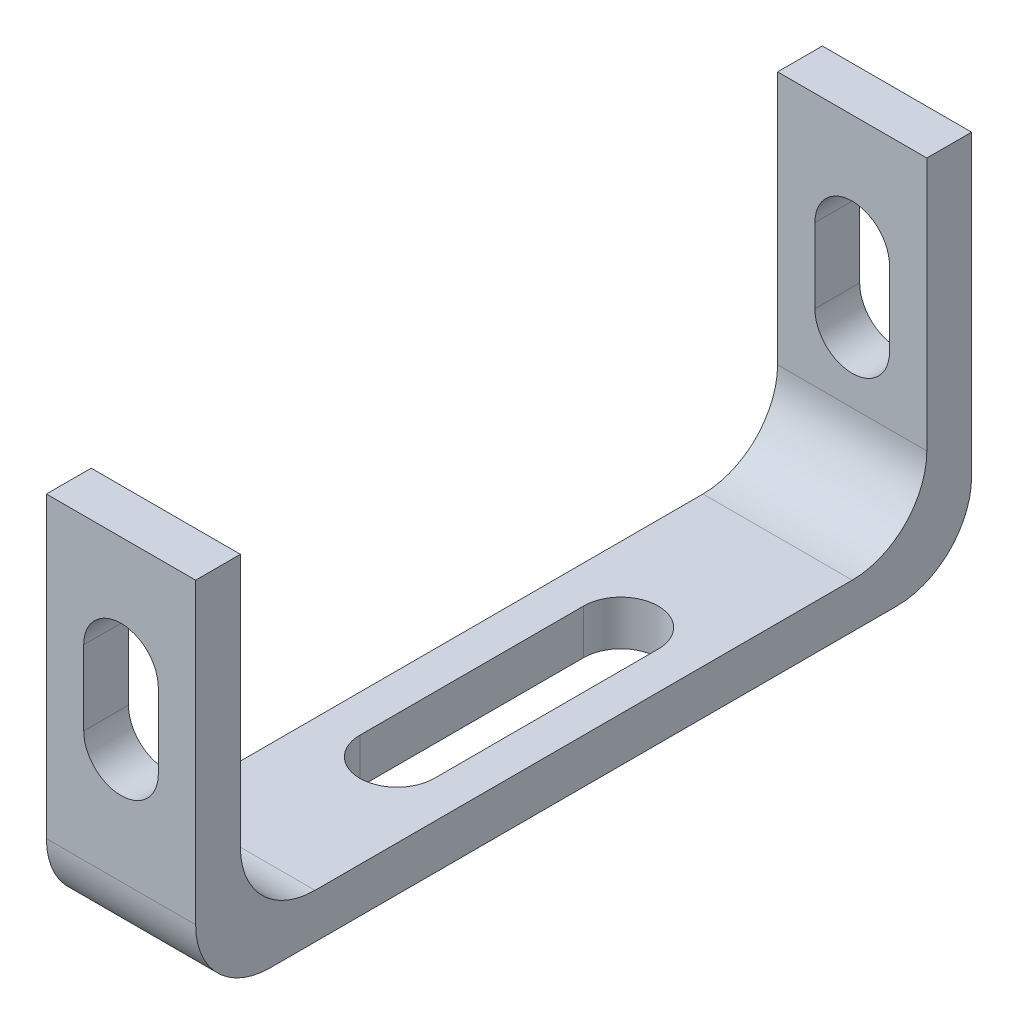
ISO-10303-21;
HEADER;
FILE_DESCRIPTION(('STEP AP214'),'2;1');
FILE_NAME('part.step','',(''),(''),'','','');
FILE_SCHEMA(('AUTOMOTIVE_DESIGN { 1 0 10303 214 1 1 1 1 }'));
ENDSEC;
DATA;
#1=APPLICATION_CONTEXT('core data for automotive mechanical design processes');
#2=APPLICATION_PROTOCOL_DEFINITION('international standard','automotive_design',2000,#1);
#3=PRODUCT_CONTEXT('',#1,'mechanical');
#4=PRODUCT('Part','Part','',(#3));
#5=PRODUCT_RELATED_PRODUCT_CATEGORY('part','',(#4));
#6=PRODUCT_DEFINITION_FORMATION('','',#4);
#7=PRODUCT_DEFINITION_CONTEXT('part definition',#1,'design');
#8=PRODUCT_DEFINITION('design','',#6,#7);
#9=PRODUCT_DEFINITION_SHAPE('','',#8);
#10=(LENGTH_UNIT() NAMED_UNIT(*) SI_UNIT(.MILLI.,.METRE.));
#11=(NAMED_UNIT(*) PLANE_ANGLE_UNIT() SI_UNIT($,.RADIAN.));
#12=(NAMED_UNIT(*) SI_UNIT($,.STERADIAN.) SOLID_ANGLE_UNIT());
#13=UNCERTAINTY_MEASURE_WITH_UNIT(LENGTH_MEASURE(1.E-05),#10,'distance_accuracy_value','');
#14=(GEOMETRIC_REPRESENTATION_CONTEXT(3) GLOBAL_UNCERTAINTY_ASSIGNED_CONTEXT((#13)) GLOBAL_UNIT_ASSIGNED_CONTEXT((#10,
#11,#12)) REPRESENTATION_CONTEXT('',''));
#15=CARTESIAN_POINT('',(0.,0.,0.));
#16=DIRECTION('',(0.,0.,1.));
#17=DIRECTION('',(1.,0.,0.));
#18=AXIS2_PLACEMENT_3D('',#15,#16,#17);
#19=CARTESIAN_POINT('',(10.,25.,0.));
#20=DIRECTION('',(0.,0.,-1.));
#21=DIRECTION('',(0.,1.,0.));
#22=AXIS2_PLACEMENT_3D('',#19,#20,#21);
#23=PLANE('',#22);
#24=DIRECTION('',(0.,-1.,0.));
#25=VECTOR('',#24,1.);
#26=CARTESIAN_POINT('',(2.5,17.5,0.));
#27=LINE('',#26,#25);
#28=CARTESIAN_POINT('',(2.5,17.5,0.));
#29=VERTEX_POINT('',#28);
#30=CARTESIAN_POINT('',(2.5,12.5,0.));
#31=VERTEX_POINT('',#30);
#32=EDGE_CURVE('E243',#29,#31,#27,.T.);
#33=ORIENTED_EDGE('',*,*,#32,.F.);
#34=CARTESIAN_POINT('',(5.,17.5,0.));
#35=DIRECTION('',(0.,0.,1.));
#36=DIRECTION('',(1.,0.,0.));
#37=AXIS2_PLACEMENT_3D('',#34,#35,#36);
#38=CIRCLE('',#37,2.5);
#39=CARTESIAN_POINT('',(7.49999999999999,17.5,0.));
#40=VERTEX_POINT('',#39);
#41=EDGE_CURVE('E55',#40,#29,#38,.T.);
#42=ORIENTED_EDGE('',*,*,#41,.F.);
#43=DIRECTION('',(0.,1.,0.));
#44=VECTOR('',#43,1.);
#45=CARTESIAN_POINT('',(7.49999999999999,17.5,0.));
#46=LINE('',#45,#44);
#47=CARTESIAN_POINT('',(7.5,12.5,0.));
#48=VERTEX_POINT('',#47);
#49=EDGE_CURVE('E230',#48,#40,#46,.T.);
#50=ORIENTED_EDGE('',*,*,#49,.F.);
#51=CARTESIAN_POINT('',(5.,12.5,0.));
#52=DIRECTION('',(0.,0.,1.));
#53=DIRECTION('',(1.,0.,0.));
#54=AXIS2_PLACEMENT_3D('',#51,#52,#53);
#55=CIRCLE('',#54,2.5);
#56=EDGE_CURVE('E234',#31,#48,#55,.T.);
#57=ORIENTED_EDGE('',*,*,#56,.F.);
#58=EDGE_LOOP('',(#33,#42,#50,#57));
#59=FACE_BOUND('',#58,.T.);
#60=DIRECTION('',(0.,-1.,0.));
#61=VECTOR('',#60,1.);
#62=CARTESIAN_POINT('',(0.,25.,0.));
#63=LINE('',#62,#61);
#64=CARTESIAN_POINT('',(0.,25.,0.));
#65=VERTEX_POINT('',#64);
#66=CARTESIAN_POINT('',(0.,5.,0.));
#67=VERTEX_POINT('',#66);
#68=EDGE_CURVE('E309',#65,#67,#63,.T.);
#69=ORIENTED_EDGE('',*,*,#68,.T.);
#70=DIRECTION('',(-1.,0.,0.));
#71=VECTOR('',#70,1.);
#72=CARTESIAN_POINT('',(10.,5.,0.));
#73=LINE('',#72,#71);
#74=CARTESIAN_POINT('',(10.,5.,0.));
#75=VERTEX_POINT('',#74);
#76=EDGE_CURVE('E403',#67,#75,#73,.F.);
#77=ORIENTED_EDGE('',*,*,#76,.T.);
#78=DIRECTION('',(0.,-1.,0.));
#79=VECTOR('',#78,1.);
#80=CARTESIAN_POINT('',(10.,25.,0.));
#81=LINE('',#80,#79);
#82=CARTESIAN_POINT('',(10.,25.,0.));
#83=VERTEX_POINT('',#82);
#84=EDGE_CURVE('E319',#83,#75,#81,.T.);
#85=ORIENTED_EDGE('',*,*,#84,.F.);
#86=DIRECTION('',(-1.,0.,0.));
#87=VECTOR('',#86,1.);
#88=CARTESIAN_POINT('',(10.,25.,0.));
#89=LINE('',#88,#87);
#90=EDGE_CURVE('E348',#83,#65,#89,.T.);
#91=ORIENTED_EDGE('',*,*,#90,.T.);
#92=EDGE_LOOP('',(#69,#77,#85,#91));
#93=FACE_BOUND('',#92,.T.);
#94=ADVANCED_FACE('F39',(#59,#93),#23,.F.);
#95=CARTESIAN_POINT('',(10.,0.,0.));
#96=DIRECTION('',(0.,1.,0.));
#97=DIRECTION('',(0.,0.,1.));
#98=AXIS2_PLACEMENT_3D('',#95,#96,#97);
#99=PLANE('',#98);
#100=DIRECTION('',(0.,0.,-1.));
#101=VECTOR('',#100,1.);
#102=CARTESIAN_POINT('',(7.5,0.,-33.5));
#103=LINE('',#102,#101);
#104=CARTESIAN_POINT('',(7.5,0.,-18.5));
#105=VERTEX_POINT('',#104);
#106=CARTESIAN_POINT('',(7.5,0.,-33.5));
#107=VERTEX_POINT('',#106);
#108=EDGE_CURVE('E288',#105,#107,#103,.T.);
#109=ORIENTED_EDGE('',*,*,#108,.T.);
#110=CARTESIAN_POINT('',(5.,0.,-33.5));
#111=DIRECTION('',(0.,1.,0.));
#112=DIRECTION('',(0.,0.,1.));
#113=AXIS2_PLACEMENT_3D('',#110,#111,#112);
#114=CIRCLE('',#113,2.5);
#115=CARTESIAN_POINT('',(2.5,0.,-33.5));
#116=VERTEX_POINT('',#115);
#117=EDGE_CURVE('E275',#107,#116,#114,.T.);
#118=ORIENTED_EDGE('',*,*,#117,.T.);
#119=DIRECTION('',(0.,0.,1.));
#120=VECTOR('',#119,1.);
#121=CARTESIAN_POINT('',(2.5,0.,-33.5));
#122=LINE('',#121,#120);
#123=CARTESIAN_POINT('',(2.5,0.,-18.5));
#124=VERTEX_POINT('',#123);
#125=EDGE_CURVE('E279',#116,#124,#122,.T.);
#126=ORIENTED_EDGE('',*,*,#125,.T.);
#127=CARTESIAN_POINT('',(5.,0.,-18.5));
#128=DIRECTION('',(0.,1.,0.));
#129=DIRECTION('',(0.,0.,1.));
#130=AXIS2_PLACEMENT_3D('',#127,#128,#129);
#131=CIRCLE('',#130,2.5);
#132=EDGE_CURVE('E284',#124,#105,#131,.T.);
#133=ORIENTED_EDGE('',*,*,#132,.T.);
#134=EDGE_LOOP('',(#109,#118,#126,#133));
#135=FACE_BOUND('',#134,.T.);
#136=DIRECTION('',(0.,0.,-1.));
#137=VECTOR('',#136,1.);
#138=CARTESIAN_POINT('',(10.,0.,0.));
#139=LINE('',#138,#137);
#140=CARTESIAN_POINT('',(10.,0.,-5.));
#141=VERTEX_POINT('',#140);
#142=CARTESIAN_POINT('',(10.,0.,-47.));
#143=VERTEX_POINT('',#142);
#144=EDGE_CURVE('E323',#141,#143,#139,.T.);
#145=ORIENTED_EDGE('',*,*,#144,.F.);
#146=DIRECTION('',(-1.,0.,0.));
#147=VECTOR('',#146,1.);
#148=CARTESIAN_POINT('',(10.,0.,-5.));
#149=LINE('',#148,#147);
#150=CARTESIAN_POINT('',(0.,0.,-5.));
#151=VERTEX_POINT('',#150);
#152=EDGE_CURVE('E393',#141,#151,#149,.T.);
#153=ORIENTED_EDGE('',*,*,#152,.T.);
#154=DIRECTION('',(0.,0.,-1.));
#155=VECTOR('',#154,1.);
#156=CARTESIAN_POINT('',(0.,0.,0.));
#157=LINE('',#156,#155);
#158=CARTESIAN_POINT('',(0.,0.,-47.));
#159=VERTEX_POINT('',#158);
#160=EDGE_CURVE('E352',#151,#159,#157,.T.);
#161=ORIENTED_EDGE('',*,*,#160,.T.);
#162=DIRECTION('',(-1.,0.,0.));
#163=VECTOR('',#162,1.);
#164=CARTESIAN_POINT('',(10.,0.,-47.));
#165=LINE('',#164,#163);
#166=EDGE_CURVE('E390',#159,#143,#165,.F.);
#167=ORIENTED_EDGE('',*,*,#166,.T.);
#168=EDGE_LOOP('',(#145,#153,#161,#167));
#169=FACE_BOUND('',#168,.T.);
#170=ADVANCED_FACE('F473',(#135,#169),#99,.F.);
#171=CARTESIAN_POINT('',(10.,0.,-52.));
#172=DIRECTION('',(0.,0.,1.));
#173=DIRECTION('',(1.,0.,0.));
#174=AXIS2_PLACEMENT_3D('',#171,#172,#173);
#175=PLANE('',#174);
#176=DIRECTION('',(0.,1.,0.));
#177=VECTOR('',#176,1.);
#178=CARTESIAN_POINT('',(7.49999999999999,17.5,-52.));
#179=LINE('',#178,#177);
#180=CARTESIAN_POINT('',(7.5,12.5,-52.));
#181=VERTEX_POINT('',#180);
#182=CARTESIAN_POINT('',(7.49999999999999,17.5,-52.));
#183=VERTEX_POINT('',#182);
#184=EDGE_CURVE('E228',#181,#183,#179,.T.);
#185=ORIENTED_EDGE('',*,*,#184,.T.);
#186=CARTESIAN_POINT('',(5.,17.5,-52.));
#187=DIRECTION('',(0.,0.,1.));
#188=DIRECTION('',(1.,0.,0.));
#189=AXIS2_PLACEMENT_3D('',#186,#187,#188);
#190=CIRCLE('',#189,2.5);
#191=CARTESIAN_POINT('',(2.5,17.5,-52.));
#192=VERTEX_POINT('',#191);
#193=EDGE_CURVE('E208',#183,#192,#190,.T.);
#194=ORIENTED_EDGE('',*,*,#193,.T.);
#195=DIRECTION('',(0.,-1.,0.));
#196=VECTOR('',#195,1.);
#197=CARTESIAN_POINT('',(2.5,17.5,-52.));
#198=LINE('',#197,#196);
#199=CARTESIAN_POINT('',(2.5,12.5,-52.));
#200=VERTEX_POINT('',#199);
#201=EDGE_CURVE('E219',#192,#200,#198,.T.);
#202=ORIENTED_EDGE('',*,*,#201,.T.);
#203=CARTESIAN_POINT('',(5.,12.5,-52.));
#204=DIRECTION('',(0.,0.,1.));
#205=DIRECTION('',(1.,0.,0.));
#206=AXIS2_PLACEMENT_3D('',#203,#204,#205);
#207=CIRCLE('',#206,2.5);
#208=EDGE_CURVE('E63',#200,#181,#207,.T.);
#209=ORIENTED_EDGE('',*,*,#208,.T.);
#210=EDGE_LOOP('',(#185,#194,#202,#209));
#211=FACE_BOUND('',#210,.T.);
#212=DIRECTION('',(0.,1.,0.));
#213=VECTOR('',#212,1.);
#214=CARTESIAN_POINT('',(10.,0.,-52.));
#215=LINE('',#214,#213);
#216=CARTESIAN_POINT('',(10.,5.,-52.));
#217=VERTEX_POINT('',#216);
#218=CARTESIAN_POINT('',(10.,25.,-52.));
#219=VERTEX_POINT('',#218);
#220=EDGE_CURVE('E328',#217,#219,#215,.T.);
#221=ORIENTED_EDGE('',*,*,#220,.F.);
#222=DIRECTION('',(-1.,0.,0.));
#223=VECTOR('',#222,1.);
#224=CARTESIAN_POINT('',(10.,5.,-52.));
#225=LINE('',#224,#223);
#226=CARTESIAN_POINT('',(0.,5.,-52.));
#227=VERTEX_POINT('',#226);
#228=EDGE_CURVE('E412',#217,#227,#225,.T.);
#229=ORIENTED_EDGE('',*,*,#228,.T.);
#230=DIRECTION('',(0.,1.,0.));
#231=VECTOR('',#230,1.);
#232=CARTESIAN_POINT('',(0.,0.,-52.));
#233=LINE('',#232,#231);
#234=CARTESIAN_POINT('',(0.,25.,-52.));
#235=VERTEX_POINT('',#234);
#236=EDGE_CURVE('E356',#227,#235,#233,.T.);
#237=ORIENTED_EDGE('',*,*,#236,.T.);
#238=DIRECTION('',(-1.,0.,0.));
#239=VECTOR('',#238,1.);
#240=CARTESIAN_POINT('',(10.,25.,-52.));
#241=LINE('',#240,#239);
#242=EDGE_CURVE('E386',#219,#235,#241,.T.);
#243=ORIENTED_EDGE('',*,*,#242,.F.);
#244=EDGE_LOOP('',(#221,#229,#237,#243));
#245=FACE_BOUND('',#244,.T.);
#246=ADVANCED_FACE('F225',(#211,#245),#175,.F.);
#247=CARTESIAN_POINT('',(10.,25.,-49.));
#248=DIRECTION('',(0.,-1.,0.));
#249=DIRECTION('',(0.,0.,-1.));
#250=AXIS2_PLACEMENT_3D('',#247,#248,#249);
#251=PLANE('',#250);
#252=DIRECTION('',(0.,0.,1.));
#253=VECTOR('',#252,1.);
#254=CARTESIAN_POINT('',(0.,25.,-49.));
#255=LINE('',#254,#253);
#256=CARTESIAN_POINT('',(0.,25.,-49.));
#257=VERTEX_POINT('',#256);
#258=EDGE_CURVE('E359',#235,#257,#255,.T.);
#259=ORIENTED_EDGE('',*,*,#258,.T.);
#260=DIRECTION('',(-1.,0.,0.));
#261=VECTOR('',#260,1.);
#262=CARTESIAN_POINT('',(10.,25.,-49.));
#263=LINE('',#262,#261);
#264=CARTESIAN_POINT('',(10.,25.,-49.));
#265=VERTEX_POINT('',#264);
#266=EDGE_CURVE('E382',#265,#257,#263,.T.);
#267=ORIENTED_EDGE('',*,*,#266,.F.);
#268=DIRECTION('',(0.,0.,1.));
#269=VECTOR('',#268,1.);
#270=CARTESIAN_POINT('',(10.,25.,-49.));
#271=LINE('',#270,#269);
#272=EDGE_CURVE('E331',#219,#265,#271,.T.);
#273=ORIENTED_EDGE('',*,*,#272,.F.);
#274=ORIENTED_EDGE('',*,*,#242,.T.);
#275=EDGE_LOOP('',(#259,#267,#273,#274));
#276=FACE_BOUND('',#275,.T.);
#277=ADVANCED_FACE('F502',(#276),#251,.F.);
#278=CARTESIAN_POINT('',(10.,3.,-49.));
#279=DIRECTION('',(0.,0.,-1.));
#280=DIRECTION('',(-1.,0.,0.));
#281=AXIS2_PLACEMENT_3D('',#278,#279,#280);
#282=PLANE('',#281);
#283=DIRECTION('',(0.,1.,0.));
#284=VECTOR('',#283,1.);
#285=CARTESIAN_POINT('',(2.5,3.,-49.));
#286=LINE('',#285,#284);
#287=CARTESIAN_POINT('',(2.5,12.5,-49.));
#288=VERTEX_POINT('',#287);
#289=CARTESIAN_POINT('',(2.5,17.5,-49.));
#290=VERTEX_POINT('',#289);
#291=EDGE_CURVE('E253',#288,#290,#286,.T.);
#292=ORIENTED_EDGE('',*,*,#291,.T.);
#293=CARTESIAN_POINT('',(5.,17.5,-49.));
#294=DIRECTION('',(0.,0.,-1.));
#295=DIRECTION('',(-1.,0.,0.));
#296=AXIS2_PLACEMENT_3D('',#293,#294,#295);
#297=CIRCLE('',#296,2.5);
#298=CARTESIAN_POINT('',(7.49999999999999,17.5,-49.));
#299=VERTEX_POINT('',#298);
#300=EDGE_CURVE('E211',#290,#299,#297,.T.);
#301=ORIENTED_EDGE('',*,*,#300,.T.);
#302=DIRECTION('',(0.,-1.,0.));
#303=VECTOR('',#302,1.);
#304=CARTESIAN_POINT('',(7.5,3.,-49.));
#305=LINE('',#304,#303);
#306=CARTESIAN_POINT('',(7.5,12.5,-49.));
#307=VERTEX_POINT('',#306);
#308=EDGE_CURVE('E268',#299,#307,#305,.T.);
#309=ORIENTED_EDGE('',*,*,#308,.T.);
#310=CARTESIAN_POINT('',(5.,12.5,-49.));
#311=DIRECTION('',(0.,0.,-1.));
#312=DIRECTION('',(-1.,0.,0.));
#313=AXIS2_PLACEMENT_3D('',#310,#311,#312);
#314=CIRCLE('',#313,2.5);
#315=EDGE_CURVE('E264',#307,#288,#314,.T.);
#316=ORIENTED_EDGE('',*,*,#315,.T.);
#317=EDGE_LOOP('',(#292,#301,#309,#316));
#318=FACE_BOUND('',#317,.T.);
#319=DIRECTION('',(0.,-1.,0.));
#320=VECTOR('',#319,1.);
#321=CARTESIAN_POINT('',(0.,3.,-49.));
#322=LINE('',#321,#320);
#323=CARTESIAN_POINT('',(0.,8.,-49.));
#324=VERTEX_POINT('',#323);
#325=EDGE_CURVE('E362',#257,#324,#322,.T.);
#326=ORIENTED_EDGE('',*,*,#325,.T.);
#327=DIRECTION('',(-1.,0.,0.));
#328=VECTOR('',#327,1.);
#329=CARTESIAN_POINT('',(10.,8.,-49.));
#330=LINE('',#329,#328);
#331=CARTESIAN_POINT('',(10.,8.,-49.));
#332=VERTEX_POINT('',#331);
#333=EDGE_CURVE('E427',#324,#332,#330,.F.);
#334=ORIENTED_EDGE('',*,*,#333,.T.);
#335=DIRECTION('',(0.,-1.,0.));
#336=VECTOR('',#335,1.);
#337=CARTESIAN_POINT('',(10.,3.,-49.));
#338=LINE('',#337,#336);
#339=EDGE_CURVE('E334',#265,#332,#338,.T.);
#340=ORIENTED_EDGE('',*,*,#339,.F.);
#341=ORIENTED_EDGE('',*,*,#266,.T.);
#342=EDGE_LOOP('',(#326,#334,#340,#341));
#343=FACE_BOUND('',#342,.T.);
#344=ADVANCED_FACE('F538',(#318,#343),#282,.F.);
#345=CARTESIAN_POINT('',(10.,3.,-3.));
#346=DIRECTION('',(0.,-1.,0.));
#347=DIRECTION('',(0.,0.,-1.));
#348=AXIS2_PLACEMENT_3D('',#345,#346,#347);
#349=PLANE('',#348);
#350=DIRECTION('',(0.,0.,1.));
#351=VECTOR('',#350,1.);
#352=CARTESIAN_POINT('',(2.5,3.,-33.5));
#353=LINE('',#352,#351);
#354=CARTESIAN_POINT('',(2.5,3.,-33.5));
#355=VERTEX_POINT('',#354);
#356=CARTESIAN_POINT('',(2.5,3.,-18.5));
#357=VERTEX_POINT('',#356);
#358=EDGE_CURVE('E295',#355,#357,#353,.T.);
#359=ORIENTED_EDGE('',*,*,#358,.F.);
#360=CARTESIAN_POINT('',(5.,3.,-33.5));
#361=DIRECTION('',(0.,1.,0.));
#362=DIRECTION('',(0.,0.,1.));
#363=AXIS2_PLACEMENT_3D('',#360,#361,#362);
#364=CIRCLE('',#363,2.5);
#365=CARTESIAN_POINT('',(7.5,3.,-33.5));
#366=VERTEX_POINT('',#365);
#367=EDGE_CURVE('E274',#366,#355,#364,.T.);
#368=ORIENTED_EDGE('',*,*,#367,.F.);
#369=DIRECTION('',(0.,0.,-1.));
#370=VECTOR('',#369,1.);
#371=CARTESIAN_POINT('',(7.5,3.,-33.5));
#372=LINE('',#371,#370);
#373=CARTESIAN_POINT('',(7.5,3.,-18.5));
#374=VERTEX_POINT('',#373);
#375=EDGE_CURVE('E280',#374,#366,#372,.T.);
#376=ORIENTED_EDGE('',*,*,#375,.F.);
#377=CARTESIAN_POINT('',(5.,3.,-18.5));
#378=DIRECTION('',(0.,1.,0.));
#379=DIRECTION('',(0.,0.,1.));
#380=AXIS2_PLACEMENT_3D('',#377,#378,#379);
#381=CIRCLE('',#380,2.5);
#382=EDGE_CURVE('E299',#357,#374,#381,.T.);
#383=ORIENTED_EDGE('',*,*,#382,.F.);
#384=EDGE_LOOP('',(#359,#368,#376,#383));
#385=FACE_BOUND('',#384,.T.);
#386=DIRECTION('',(0.,0.,1.));
#387=VECTOR('',#386,1.);
#388=CARTESIAN_POINT('',(0.,3.,-3.));
#389=LINE('',#388,#387);
#390=CARTESIAN_POINT('',(0.,3.,-44.));
#391=VERTEX_POINT('',#390);
#392=CARTESIAN_POINT('',(0.,3.,-8.));
#393=VERTEX_POINT('',#392);
#394=EDGE_CURVE('E366',#391,#393,#389,.T.);
#395=ORIENTED_EDGE('',*,*,#394,.T.);
#396=DIRECTION('',(-1.,0.,0.));
#397=VECTOR('',#396,1.);
#398=CARTESIAN_POINT('',(10.,3.,-8.));
#399=LINE('',#398,#397);
#400=CARTESIAN_POINT('',(10.,3.,-8.));
#401=VERTEX_POINT('',#400);
#402=EDGE_CURVE('E424',#393,#401,#399,.F.);
#403=ORIENTED_EDGE('',*,*,#402,.T.);
#404=DIRECTION('',(0.,0.,1.));
#405=VECTOR('',#404,1.);
#406=CARTESIAN_POINT('',(10.,3.,-3.));
#407=LINE('',#406,#405);
#408=CARTESIAN_POINT('',(10.,3.,-44.));
#409=VERTEX_POINT('',#408);
#410=EDGE_CURVE('E338',#409,#401,#407,.T.);
#411=ORIENTED_EDGE('',*,*,#410,.F.);
#412=DIRECTION('',(-1.,0.,0.));
#413=VECTOR('',#412,1.);
#414=CARTESIAN_POINT('',(0.,3.,-44.));
#415=LINE('',#414,#413);
#416=EDGE_CURVE('E420',#409,#391,#415,.T.);
#417=ORIENTED_EDGE('',*,*,#416,.T.);
#418=EDGE_LOOP('',(#395,#403,#411,#417));
#419=FACE_BOUND('',#418,.T.);
#420=ADVANCED_FACE('F512',(#385,#419),#349,.F.);
#421=CARTESIAN_POINT('',(10.,25.,-3.));
#422=DIRECTION('',(0.,0.,1.));
#423=DIRECTION('',(0.,-1.,0.));
#424=AXIS2_PLACEMENT_3D('',#421,#422,#423);
#425=PLANE('',#424);
#426=DIRECTION('',(0.,1.,0.));
#427=VECTOR('',#426,1.);
#428=CARTESIAN_POINT('',(7.49999999999999,25.,-3.));
#429=LINE('',#428,#427);
#430=CARTESIAN_POINT('',(7.5,12.5,-3.00000000000002));
#431=VERTEX_POINT('',#430);
#432=CARTESIAN_POINT('',(7.49999999999999,17.5,-3.00000000000002));
#433=VERTEX_POINT('',#432);
#434=EDGE_CURVE('E48',#431,#433,#429,.T.);
#435=ORIENTED_EDGE('',*,*,#434,.T.);
#436=CARTESIAN_POINT('',(5.,17.5,-3.));
#437=DIRECTION('',(0.,0.,1.));
#438=DIRECTION('',(0.,-1.,0.));
#439=AXIS2_PLACEMENT_3D('',#436,#437,#438);
#440=CIRCLE('',#439,2.5);
#441=CARTESIAN_POINT('',(2.5,17.5,-3.00000000000002));
#442=VERTEX_POINT('',#441);
#443=EDGE_CURVE('E11',#433,#442,#440,.T.);
#444=ORIENTED_EDGE('',*,*,#443,.T.);
#445=DIRECTION('',(0.,-1.,0.));
#446=VECTOR('',#445,1.);
#447=CARTESIAN_POINT('',(2.5,25.,-3.));
#448=LINE('',#447,#446);
#449=CARTESIAN_POINT('',(2.5,12.5,-3.));
#450=VERTEX_POINT('',#449);
#451=EDGE_CURVE('E442',#442,#450,#448,.T.);
#452=ORIENTED_EDGE('',*,*,#451,.T.);
#453=CARTESIAN_POINT('',(5.,12.5,-3.));
#454=DIRECTION('',(0.,0.,1.));
#455=DIRECTION('',(0.,-1.,0.));
#456=AXIS2_PLACEMENT_3D('',#453,#454,#455);
#457=CIRCLE('',#456,2.5);
#458=EDGE_CURVE('E446',#450,#431,#457,.T.);
#459=ORIENTED_EDGE('',*,*,#458,.T.);
#460=EDGE_LOOP('',(#435,#444,#452,#459));
#461=FACE_BOUND('',#460,.T.);
#462=DIRECTION('',(0.,1.,0.));
#463=VECTOR('',#462,1.);
#464=CARTESIAN_POINT('',(10.,25.,-3.));
#465=LINE('',#464,#463);
#466=CARTESIAN_POINT('',(10.,8.,-3.));
#467=VERTEX_POINT('',#466);
#468=CARTESIAN_POINT('',(10.,25.,-3.));
#469=VERTEX_POINT('',#468);
#470=EDGE_CURVE('E342',#467,#469,#465,.T.);
#471=ORIENTED_EDGE('',*,*,#470,.F.);
#472=DIRECTION('',(-1.,0.,0.));
#473=VECTOR('',#472,1.);
#474=CARTESIAN_POINT('',(0.,8.,-3.));
#475=LINE('',#474,#473);
#476=CARTESIAN_POINT('',(0.,8.,-3.));
#477=VERTEX_POINT('',#476);
#478=EDGE_CURVE('E416',#467,#477,#475,.T.);
#479=ORIENTED_EDGE('',*,*,#478,.T.);
#480=DIRECTION('',(0.,1.,0.));
#481=VECTOR('',#480,1.);
#482=CARTESIAN_POINT('',(0.,25.,-3.));
#483=LINE('',#482,#481);
#484=CARTESIAN_POINT('',(0.,25.,-3.));
#485=VERTEX_POINT('',#484);
#486=EDGE_CURVE('E370',#477,#485,#483,.T.);
#487=ORIENTED_EDGE('',*,*,#486,.T.);
#488=DIRECTION('',(-1.,0.,0.));
#489=VECTOR('',#488,1.);
#490=CARTESIAN_POINT('',(10.,25.,-3.));
#491=LINE('',#490,#489);
#492=EDGE_CURVE('E378',#469,#485,#491,.T.);
#493=ORIENTED_EDGE('',*,*,#492,.F.);
#494=EDGE_LOOP('',(#471,#479,#487,#493));
#495=FACE_BOUND('',#494,.T.);
#496=ADVANCED_FACE('F452',(#461,#495),#425,.F.);
#497=CARTESIAN_POINT('',(10.,25.,0.));
#498=DIRECTION('',(0.,-1.,0.));
#499=DIRECTION('',(0.,0.,-1.));
#500=AXIS2_PLACEMENT_3D('',#497,#498,#499);
#501=PLANE('',#500);
#502=DIRECTION('',(0.,0.,1.));
#503=VECTOR('',#502,1.);
#504=CARTESIAN_POINT('',(0.,25.,0.));
#505=LINE('',#504,#503);
#506=EDGE_CURVE('E324',#485,#65,#505,.T.);
#507=ORIENTED_EDGE('',*,*,#506,.T.);
#508=ORIENTED_EDGE('',*,*,#90,.F.);
#509=DIRECTION('',(0.,0.,1.));
#510=VECTOR('',#509,1.);
#511=CARTESIAN_POINT('',(10.,25.,0.));
#512=LINE('',#511,#510);
#513=EDGE_CURVE('E345',#469,#83,#512,.T.);
#514=ORIENTED_EDGE('',*,*,#513,.F.);
#515=ORIENTED_EDGE('',*,*,#492,.T.);
#516=EDGE_LOOP('',(#507,#508,#514,#515));
#517=FACE_BOUND('',#516,.T.);
#518=ADVANCED_FACE('F525',(#517),#501,.F.);
#519=CARTESIAN_POINT('',(10.,0.,0.));
#520=DIRECTION('',(1.,0.,0.));
#521=DIRECTION('',(0.,0.,-1.));
#522=AXIS2_PLACEMENT_3D('',#519,#520,#521);
#523=PLANE('',#522);
#524=ORIENTED_EDGE('',*,*,#84,.T.);
#525=CARTESIAN_POINT('',(10.,5.,-5.));
#526=DIRECTION('',(1.,0.,0.));
#527=DIRECTION('',(0.,0.,-1.));
#528=AXIS2_PLACEMENT_3D('',#525,#526,#527);
#529=CIRCLE('',#528,5.);
#530=EDGE_CURVE('E409',#75,#141,#529,.T.);
#531=ORIENTED_EDGE('',*,*,#530,.T.);
#532=ORIENTED_EDGE('',*,*,#144,.T.);
#533=CARTESIAN_POINT('',(10.,5.,-47.));
#534=DIRECTION('',(1.,0.,0.));
#535=DIRECTION('',(0.,0.,-1.));
#536=AXIS2_PLACEMENT_3D('',#533,#534,#535);
#537=CIRCLE('',#536,5.);
#538=EDGE_CURVE('E406',#143,#217,#537,.T.);
#539=ORIENTED_EDGE('',*,*,#538,.T.);
#540=ORIENTED_EDGE('',*,*,#220,.T.);
#541=ORIENTED_EDGE('',*,*,#272,.T.);
#542=ORIENTED_EDGE('',*,*,#339,.T.);
#543=CARTESIAN_POINT('',(10.,8.,-44.));
#544=DIRECTION('',(1.,0.,0.));
#545=DIRECTION('',(0.,0.,-1.));
#546=AXIS2_PLACEMENT_3D('',#543,#544,#545);
#547=CIRCLE('',#546,5.);
#548=EDGE_CURVE('E439',#332,#409,#547,.F.);
#549=ORIENTED_EDGE('',*,*,#548,.T.);
#550=ORIENTED_EDGE('',*,*,#410,.T.);
#551=CARTESIAN_POINT('',(10.,8.,-8.));
#552=DIRECTION('',(1.,0.,0.));
#553=DIRECTION('',(0.,0.,-1.));
#554=AXIS2_PLACEMENT_3D('',#551,#552,#553);
#555=CIRCLE('',#554,5.);
#556=EDGE_CURVE('E433',#401,#467,#555,.F.);
#557=ORIENTED_EDGE('',*,*,#556,.T.);
#558=ORIENTED_EDGE('',*,*,#470,.T.);
#559=ORIENTED_EDGE('',*,*,#513,.T.);
#560=EDGE_LOOP('',(#524,#531,#532,#539,#540,#541,#542,#549,#550,#557,#558,#559));
#561=FACE_BOUND('',#560,.T.);
#562=ADVANCED_FACE('F487',(#561),#523,.T.);
#563=CARTESIAN_POINT('',(0.,0.,0.));
#564=DIRECTION('',(1.,0.,0.));
#565=DIRECTION('',(0.,0.,-1.));
#566=AXIS2_PLACEMENT_3D('',#563,#564,#565);
#567=PLANE('',#566);
#568=ORIENTED_EDGE('',*,*,#160,.F.);
#569=CARTESIAN_POINT('',(0.,5.,-5.));
#570=DIRECTION('',(1.,0.,0.));
#571=DIRECTION('',(0.,0.,-1.));
#572=AXIS2_PLACEMENT_3D('',#569,#570,#571);
#573=CIRCLE('',#572,5.);
#574=EDGE_CURVE('E400',#151,#67,#573,.F.);
#575=ORIENTED_EDGE('',*,*,#574,.T.);
#576=ORIENTED_EDGE('',*,*,#68,.F.);
#577=ORIENTED_EDGE('',*,*,#506,.F.);
#578=ORIENTED_EDGE('',*,*,#486,.F.);
#579=CARTESIAN_POINT('',(0.,8.,-8.));
#580=DIRECTION('',(1.,0.,0.));
#581=DIRECTION('',(0.,0.,-1.));
#582=AXIS2_PLACEMENT_3D('',#579,#580,#581);
#583=CIRCLE('',#582,5.);
#584=EDGE_CURVE('E430',#477,#393,#583,.T.);
#585=ORIENTED_EDGE('',*,*,#584,.T.);
#586=ORIENTED_EDGE('',*,*,#394,.F.);
#587=CARTESIAN_POINT('',(0.,8.,-44.));
#588=DIRECTION('',(1.,0.,0.));
#589=DIRECTION('',(0.,0.,-1.));
#590=AXIS2_PLACEMENT_3D('',#587,#588,#589);
#591=CIRCLE('',#590,5.);
#592=EDGE_CURVE('E436',#391,#324,#591,.T.);
#593=ORIENTED_EDGE('',*,*,#592,.T.);
#594=ORIENTED_EDGE('',*,*,#325,.F.);
#595=ORIENTED_EDGE('',*,*,#258,.F.);
#596=ORIENTED_EDGE('',*,*,#236,.F.);
#597=CARTESIAN_POINT('',(0.,5.,-47.));
#598=DIRECTION('',(1.,0.,0.));
#599=DIRECTION('',(0.,0.,-1.));
#600=AXIS2_PLACEMENT_3D('',#597,#598,#599);
#601=CIRCLE('',#600,5.);
#602=EDGE_CURVE('E397',#227,#159,#601,.F.);
#603=ORIENTED_EDGE('',*,*,#602,.T.);
#604=EDGE_LOOP('',(#568,#575,#576,#577,#578,#585,#586,#593,#594,#595,#596,#603));
#605=FACE_BOUND('',#604,.T.);
#606=ADVANCED_FACE('F514',(#605),#567,.F.);
#607=CARTESIAN_POINT('',(10.,5.,-5.));
#608=DIRECTION('',(-1.,0.,0.));
#609=DIRECTION('',(0.,0.,1.));
#610=AXIS2_PLACEMENT_3D('',#607,#608,#609);
#611=CYLINDRICAL_SURFACE('',#610,5.);
#612=ORIENTED_EDGE('',*,*,#530,.F.);
#613=ORIENTED_EDGE('',*,*,#76,.F.);
#614=ORIENTED_EDGE('',*,*,#574,.F.);
#615=ORIENTED_EDGE('',*,*,#152,.F.);
#616=EDGE_LOOP('',(#612,#613,#614,#615));
#617=FACE_BOUND('',#616,.T.);
#618=ADVANCED_FACE('F483',(#617),#611,.T.);
#619=CARTESIAN_POINT('',(10.,5.,-47.));
#620=DIRECTION('',(-1.,0.,0.));
#621=DIRECTION('',(0.,0.,1.));
#622=AXIS2_PLACEMENT_3D('',#619,#620,#621);
#623=CYLINDRICAL_SURFACE('',#622,5.);
#624=ORIENTED_EDGE('',*,*,#538,.F.);
#625=ORIENTED_EDGE('',*,*,#166,.F.);
#626=ORIENTED_EDGE('',*,*,#602,.F.);
#627=ORIENTED_EDGE('',*,*,#228,.F.);
#628=EDGE_LOOP('',(#624,#625,#626,#627));
#629=FACE_BOUND('',#628,.T.);
#630=ADVANCED_FACE('F493',(#629),#623,.T.);
#631=CARTESIAN_POINT('',(10.,8.,-8.));
#632=DIRECTION('',(1.,0.,0.));
#633=DIRECTION('',(0.,0.,-1.));
#634=AXIS2_PLACEMENT_3D('',#631,#632,#633);
#635=CYLINDRICAL_SURFACE('',#634,5.);
#636=ORIENTED_EDGE('',*,*,#556,.F.);
#637=ORIENTED_EDGE('',*,*,#402,.F.);
#638=ORIENTED_EDGE('',*,*,#584,.F.);
#639=ORIENTED_EDGE('',*,*,#478,.F.);
#640=EDGE_LOOP('',(#636,#637,#638,#639));
#641=FACE_BOUND('',#640,.T.);
#642=ADVANCED_FACE('F520',(#641),#635,.F.);
#643=CARTESIAN_POINT('',(10.,8.,-44.));
#644=DIRECTION('',(1.,0.,0.));
#645=DIRECTION('',(0.,0.,-1.));
#646=AXIS2_PLACEMENT_3D('',#643,#644,#645);
#647=CYLINDRICAL_SURFACE('',#646,5.);
#648=ORIENTED_EDGE('',*,*,#548,.F.);
#649=ORIENTED_EDGE('',*,*,#333,.F.);
#650=ORIENTED_EDGE('',*,*,#592,.F.);
#651=ORIENTED_EDGE('',*,*,#416,.F.);
#652=EDGE_LOOP('',(#648,#649,#650,#651));
#653=FACE_BOUND('',#652,.T.);
#654=ADVANCED_FACE('F41',(#653),#647,.F.);
#655=CARTESIAN_POINT('',(5.,0.,-33.5));
#656=DIRECTION('',(0.,1.,0.));
#657=DIRECTION('',(0.,0.,1.));
#658=AXIS2_PLACEMENT_3D('',#655,#656,#657);
#659=CYLINDRICAL_SURFACE('',#658,2.5);
#660=ORIENTED_EDGE('',*,*,#367,.T.);
#661=DIRECTION('',(0.,1.,0.));
#662=VECTOR('',#661,1.);
#663=CARTESIAN_POINT('',(2.5,0.,-33.5));
#664=LINE('',#663,#662);
#665=EDGE_CURVE('E292',#116,#355,#664,.T.);
#666=ORIENTED_EDGE('',*,*,#665,.F.);
#667=ORIENTED_EDGE('',*,*,#117,.F.);
#668=DIRECTION('',(0.,1.,0.));
#669=VECTOR('',#668,1.);
#670=CARTESIAN_POINT('',(7.5,0.,-33.5));
#671=LINE('',#670,#669);
#672=EDGE_CURVE('E306',#107,#366,#671,.T.);
#673=ORIENTED_EDGE('',*,*,#672,.T.);
#674=EDGE_LOOP('',(#660,#666,#667,#673));
#675=FACE_BOUND('',#674,.T.);
#676=ADVANCED_FACE('F557',(#675),#659,.F.);
#677=CARTESIAN_POINT('',(7.5,0.,-33.5));
#678=DIRECTION('',(1.,0.,0.));
#679=DIRECTION('',(0.,0.,-1.));
#680=AXIS2_PLACEMENT_3D('',#677,#678,#679);
#681=PLANE('',#680);
#682=ORIENTED_EDGE('',*,*,#375,.T.);
#683=ORIENTED_EDGE('',*,*,#672,.F.);
#684=ORIENTED_EDGE('',*,*,#108,.F.);
#685=DIRECTION('',(0.,1.,0.));
#686=VECTOR('',#685,1.);
#687=CARTESIAN_POINT('',(7.5,0.,-18.5));
#688=LINE('',#687,#686);
#689=EDGE_CURVE('E310',#105,#374,#688,.T.);
#690=ORIENTED_EDGE('',*,*,#689,.T.);
#691=EDGE_LOOP('',(#682,#683,#684,#690));
#692=FACE_BOUND('',#691,.T.);
#693=ADVANCED_FACE('F561',(#692),#681,.F.);
#694=CARTESIAN_POINT('',(5.,0.,-18.5));
#695=DIRECTION('',(0.,1.,0.));
#696=DIRECTION('',(0.,0.,1.));
#697=AXIS2_PLACEMENT_3D('',#694,#695,#696);
#698=CYLINDRICAL_SURFACE('',#697,2.5);
#699=ORIENTED_EDGE('',*,*,#382,.T.);
#700=ORIENTED_EDGE('',*,*,#689,.F.);
#701=ORIENTED_EDGE('',*,*,#132,.F.);
#702=DIRECTION('',(0.,1.,0.));
#703=VECTOR('',#702,1.);
#704=CARTESIAN_POINT('',(2.5,0.,-18.5));
#705=LINE('',#704,#703);
#706=EDGE_CURVE('E313',#124,#357,#705,.T.);
#707=ORIENTED_EDGE('',*,*,#706,.T.);
#708=EDGE_LOOP('',(#699,#700,#701,#707));
#709=FACE_BOUND('',#708,.T.);
#710=ADVANCED_FACE('F567',(#709),#698,.F.);
#711=CARTESIAN_POINT('',(2.5,0.,-33.5));
#712=DIRECTION('',(-1.,0.,0.));
#713=DIRECTION('',(0.,0.,1.));
#714=AXIS2_PLACEMENT_3D('',#711,#712,#713);
#715=PLANE('',#714);
#716=ORIENTED_EDGE('',*,*,#358,.T.);
#717=ORIENTED_EDGE('',*,*,#706,.F.);
#718=ORIENTED_EDGE('',*,*,#125,.F.);
#719=ORIENTED_EDGE('',*,*,#665,.T.);
#720=EDGE_LOOP('',(#716,#717,#718,#719));
#721=FACE_BOUND('',#720,.T.);
#722=ADVANCED_FACE('F571',(#721),#715,.F.);
#723=CARTESIAN_POINT('',(2.5,17.5,-52.));
#724=DIRECTION('',(-1.,0.,0.));
#725=DIRECTION('',(0.,-1.,0.));
#726=AXIS2_PLACEMENT_3D('',#723,#724,#725);
#727=PLANE('',#726);
#728=DIRECTION('',(0.,0.,1.));
#729=VECTOR('',#728,1.);
#730=CARTESIAN_POINT('',(2.5,17.5,-52.));
#731=LINE('',#730,#729);
#732=EDGE_CURVE('E216',#442,#29,#731,.T.);
#733=ORIENTED_EDGE('',*,*,#732,.T.);
#734=ORIENTED_EDGE('',*,*,#32,.T.);
#735=DIRECTION('',(0.,0.,1.));
#736=VECTOR('',#735,1.);
#737=CARTESIAN_POINT('',(2.5,12.5,-52.));
#738=LINE('',#737,#736);
#739=EDGE_CURVE('E215',#450,#31,#738,.T.);
#740=ORIENTED_EDGE('',*,*,#739,.F.);
#741=ORIENTED_EDGE('',*,*,#451,.F.);
#742=EDGE_LOOP('',(#733,#734,#740,#741));
#743=FACE_BOUND('',#742,.T.);
#744=ADVANCED_FACE('F469',(#743),#727,.F.);
#745=CARTESIAN_POINT('',(5.,12.5,-52.));
#746=DIRECTION('',(0.,0.,1.));
#747=DIRECTION('',(1.,0.,0.));
#748=AXIS2_PLACEMENT_3D('',#745,#746,#747);
#749=CYLINDRICAL_SURFACE('',#748,2.5);
#750=ORIENTED_EDGE('',*,*,#739,.T.);
#751=ORIENTED_EDGE('',*,*,#56,.T.);
#752=DIRECTION('',(0.,0.,1.));
#753=VECTOR('',#752,1.);
#754=CARTESIAN_POINT('',(7.5,12.5,-52.));
#755=LINE('',#754,#753);
#756=EDGE_CURVE('E259',#431,#48,#755,.T.);
#757=ORIENTED_EDGE('',*,*,#756,.F.);
#758=ORIENTED_EDGE('',*,*,#458,.F.);
#759=EDGE_LOOP('',(#750,#751,#757,#758));
#760=FACE_BOUND('',#759,.T.);
#761=ADVANCED_FACE('F460',(#760),#749,.F.);
#762=CARTESIAN_POINT('',(7.49999999999999,17.5,-52.));
#763=DIRECTION('',(1.,0.,0.));
#764=DIRECTION('',(0.,1.,0.));
#765=AXIS2_PLACEMENT_3D('',#762,#763,#764);
#766=PLANE('',#765);
#767=ORIENTED_EDGE('',*,*,#756,.T.);
#768=ORIENTED_EDGE('',*,*,#49,.T.);
#769=DIRECTION('',(0.,0.,1.));
#770=VECTOR('',#769,1.);
#771=CARTESIAN_POINT('',(7.49999999999999,17.5,-52.));
#772=LINE('',#771,#770);
#773=EDGE_CURVE('E254',#433,#40,#772,.T.);
#774=ORIENTED_EDGE('',*,*,#773,.F.);
#775=ORIENTED_EDGE('',*,*,#434,.F.);
#776=EDGE_LOOP('',(#767,#768,#774,#775));
#777=FACE_BOUND('',#776,.T.);
#778=ADVANCED_FACE('F458',(#777),#766,.F.);
#779=CARTESIAN_POINT('',(5.,17.5,-52.));
#780=DIRECTION('',(0.,0.,1.));
#781=DIRECTION('',(1.,0.,0.));
#782=AXIS2_PLACEMENT_3D('',#779,#780,#781);
#783=CYLINDRICAL_SURFACE('',#782,2.5);
#784=ORIENTED_EDGE('',*,*,#773,.T.);
#785=ORIENTED_EDGE('',*,*,#41,.T.);
#786=ORIENTED_EDGE('',*,*,#732,.F.);
#787=ORIENTED_EDGE('',*,*,#443,.F.);
#788=EDGE_LOOP('',(#784,#785,#786,#787));
#789=FACE_BOUND('',#788,.T.);
#790=ADVANCED_FACE('F581',(#789),#783,.F.);
#791=EDGE_CURVE('E203',#192,#290,#731,.T.);
#792=ORIENTED_EDGE('',*,*,#791,.F.);
#793=ORIENTED_EDGE('',*,*,#193,.F.);
#794=EDGE_CURVE('E250',#183,#299,#772,.T.);
#795=ORIENTED_EDGE('',*,*,#794,.T.);
#796=ORIENTED_EDGE('',*,*,#300,.F.);
#797=EDGE_LOOP('',(#792,#793,#795,#796));
#798=FACE_BOUND('',#797,.T.);
#799=ADVANCED_FACE('F205',(#798),#783,.F.);
#800=ORIENTED_EDGE('',*,*,#794,.F.);
#801=ORIENTED_EDGE('',*,*,#184,.F.);
#802=EDGE_CURVE('E255',#181,#307,#755,.T.);
#803=ORIENTED_EDGE('',*,*,#802,.T.);
#804=ORIENTED_EDGE('',*,*,#308,.F.);
#805=EDGE_LOOP('',(#800,#801,#803,#804));
#806=FACE_BOUND('',#805,.T.);
#807=ADVANCED_FACE('F580',(#806),#766,.F.);
#808=ORIENTED_EDGE('',*,*,#802,.F.);
#809=ORIENTED_EDGE('',*,*,#208,.F.);
#810=EDGE_CURVE('E221',#200,#288,#738,.T.);
#811=ORIENTED_EDGE('',*,*,#810,.T.);
#812=ORIENTED_EDGE('',*,*,#315,.F.);
#813=EDGE_LOOP('',(#808,#809,#811,#812));
#814=FACE_BOUND('',#813,.T.);
#815=ADVANCED_FACE('F584',(#814),#749,.F.);
#816=ORIENTED_EDGE('',*,*,#810,.F.);
#817=ORIENTED_EDGE('',*,*,#201,.F.);
#818=ORIENTED_EDGE('',*,*,#791,.T.);
#819=ORIENTED_EDGE('',*,*,#291,.F.);
#820=EDGE_LOOP('',(#816,#817,#818,#819));
#821=FACE_BOUND('',#820,.T.);
#822=ADVANCED_FACE('F220',(#821),#727,.F.);
#823=CLOSED_SHELL('',(#94,#170,#246,#277,#344,#420,#496,#518,#562,#606,#618,#630,#642,#654,#676,
#693,#710,#722,#744,#761,#778,#790,#799,#807,#815,#822));
#824=MANIFOLD_SOLID_BREP('B2',#823);
#825=ADVANCED_BREP_SHAPE_REPRESENTATION('',(#18,#824),#14);
#826=SHAPE_DEFINITION_REPRESENTATION(#9,#825);
ENDSEC;
END-ISO-10303-21;
